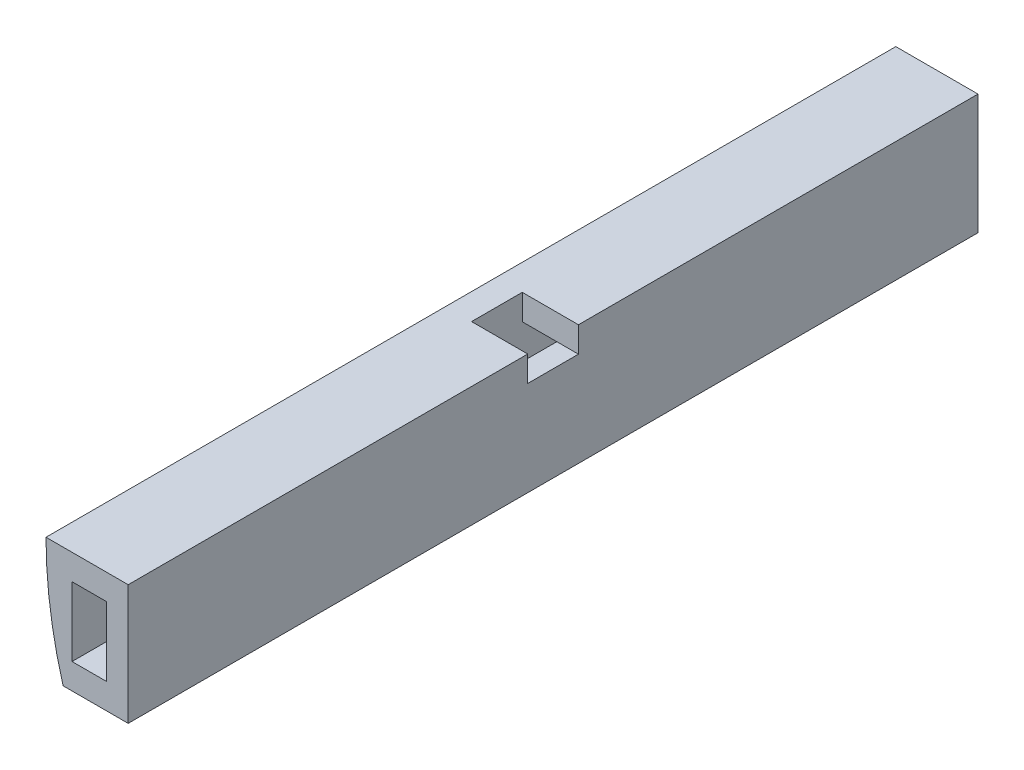
ISO-10303-21;
HEADER;
FILE_DESCRIPTION(('STEP AP214'),'2;1');
FILE_NAME('part.step','',(''),(''),'','','');
FILE_SCHEMA(('AUTOMOTIVE_DESIGN { 1 0 10303 214 1 1 1 1 }'));
ENDSEC;
DATA;
#1=APPLICATION_CONTEXT('core data for automotive mechanical design processes');
#2=APPLICATION_PROTOCOL_DEFINITION('international standard','automotive_design',2000,#1);
#3=PRODUCT_CONTEXT('',#1,'mechanical');
#4=PRODUCT('Part','Part','',(#3));
#5=PRODUCT_RELATED_PRODUCT_CATEGORY('part','',(#4));
#6=PRODUCT_DEFINITION_FORMATION('','',#4);
#7=PRODUCT_DEFINITION_CONTEXT('part definition',#1,'design');
#8=PRODUCT_DEFINITION('design','',#6,#7);
#9=PRODUCT_DEFINITION_SHAPE('','',#8);
#10=(LENGTH_UNIT() NAMED_UNIT(*) SI_UNIT(.MILLI.,.METRE.));
#11=(NAMED_UNIT(*) PLANE_ANGLE_UNIT() SI_UNIT($,.RADIAN.));
#12=(NAMED_UNIT(*) SI_UNIT($,.STERADIAN.) SOLID_ANGLE_UNIT());
#13=UNCERTAINTY_MEASURE_WITH_UNIT(LENGTH_MEASURE(1.E-05),#10,'distance_accuracy_value','');
#14=(GEOMETRIC_REPRESENTATION_CONTEXT(3) GLOBAL_UNCERTAINTY_ASSIGNED_CONTEXT((#13)) GLOBAL_UNIT_ASSIGNED_CONTEXT((#10,
#11,#12)) REPRESENTATION_CONTEXT('',''));
#15=CARTESIAN_POINT('',(0.,0.,0.));
#16=DIRECTION('',(0.,0.,1.));
#17=DIRECTION('',(1.,0.,0.));
#18=AXIS2_PLACEMENT_3D('',#15,#16,#17);
#19=CARTESIAN_POINT('',(0.,-4.4958,149.86));
#20=DIRECTION('',(0.,1.,0.));
#21=DIRECTION('',(0.,0.,1.));
#22=AXIS2_PLACEMENT_3D('',#19,#20,#21);
#23=PLANE('',#22);
#24=DIRECTION('',(-1.,0.,0.));
#25=VECTOR('',#24,1.);
#26=CARTESIAN_POINT('',(-61.5779714003076,-4.4958,70.4596));
#27=LINE('',#26,#25);
#28=CARTESIAN_POINT('',(-61.5779714003076,-4.4958,70.4596));
#29=VERTEX_POINT('',#28);
#30=CARTESIAN_POINT('',(-65.3879714003076,-4.4958,70.4596));
#31=VERTEX_POINT('',#30);
#32=EDGE_CURVE('E137',#29,#31,#27,.T.);
#33=ORIENTED_EDGE('',*,*,#32,.T.);
#34=DIRECTION('',(0.,0.,-1.));
#35=VECTOR('',#34,1.);
#36=CARTESIAN_POINT('',(-65.3879714003076,-4.4958,149.86));
#37=LINE('',#36,#35);
#38=CARTESIAN_POINT('',(-65.3879714003076,-4.4958,79.4004));
#39=VERTEX_POINT('',#38);
#40=EDGE_CURVE('E172',#39,#31,#37,.T.);
#41=ORIENTED_EDGE('',*,*,#40,.F.);
#42=DIRECTION('',(1.,0.,0.));
#43=VECTOR('',#42,1.);
#44=CARTESIAN_POINT('',(-61.5779714003076,-4.4958,79.4004));
#45=LINE('',#44,#43);
#46=CARTESIAN_POINT('',(-61.5779714003076,-4.4958,79.4004));
#47=VERTEX_POINT('',#46);
#48=EDGE_CURVE('E162',#39,#47,#45,.T.);
#49=ORIENTED_EDGE('',*,*,#48,.T.);
#50=DIRECTION('',(0.,0.,-1.));
#51=VECTOR('',#50,1.);
#52=CARTESIAN_POINT('',(-61.5779714003076,-4.4958,149.86));
#53=LINE('',#52,#51);
#54=EDGE_CURVE('E154',#47,#29,#53,.T.);
#55=ORIENTED_EDGE('',*,*,#54,.T.);
#56=EDGE_LOOP('',(#33,#41,#49,#55));
#57=FACE_BOUND('',#56,.T.);
#58=ADVANCED_FACE('F41',(#57),#23,.T.);
#59=CARTESIAN_POINT('',(-71.4839714003076,0.,149.86));
#60=DIRECTION('',(-1.,0.,0.));
#61=DIRECTION('',(0.,0.,1.));
#62=AXIS2_PLACEMENT_3D('',#59,#60,#61);
#63=PLANE('',#62);
#64=DIRECTION('',(0.,1.,0.));
#65=VECTOR('',#64,1.);
#66=CARTESIAN_POINT('',(-71.4839714003076,0.,0.));
#67=LINE('',#66,#65);
#68=CARTESIAN_POINT('',(-71.4839714003076,-16.6878,0.));
#69=VERTEX_POINT('',#68);
#70=CARTESIAN_POINT('',(-71.4839714003076,-4.4958,0.));
#71=VERTEX_POINT('',#70);
#72=EDGE_CURVE('E202',#69,#71,#67,.T.);
#73=ORIENTED_EDGE('',*,*,#72,.T.);
#74=DIRECTION('',(0.,0.,-1.));
#75=VECTOR('',#74,1.);
#76=CARTESIAN_POINT('',(-71.4839714003076,-4.4958,70.4596));
#77=LINE('',#76,#75);
#78=CARTESIAN_POINT('',(-71.4839714003076,-4.4958,70.4596));
#79=VERTEX_POINT('',#78);
#80=EDGE_CURVE('E57',#79,#71,#77,.T.);
#81=ORIENTED_EDGE('',*,*,#80,.F.);
#82=DIRECTION('',(0.,1.,0.));
#83=VECTOR('',#82,1.);
#84=CARTESIAN_POINT('',(-71.4839714003076,-4.4958,70.4596));
#85=LINE('',#84,#83);
#86=CARTESIAN_POINT('',(-71.4839714003076,0.,70.4596));
#87=VERTEX_POINT('',#86);
#88=EDGE_CURVE('E62',#79,#87,#85,.T.);
#89=ORIENTED_EDGE('',*,*,#88,.T.);
#90=DIRECTION('',(0.,0.,-1.));
#91=VECTOR('',#90,1.);
#92=CARTESIAN_POINT('',(-71.4839714003076,0.,149.86));
#93=LINE('',#92,#91);
#94=CARTESIAN_POINT('',(-71.4839714003076,0.,79.4004));
#95=VERTEX_POINT('',#94);
#96=EDGE_CURVE('E11',#95,#87,#93,.T.);
#97=ORIENTED_EDGE('',*,*,#96,.F.);
#98=DIRECTION('',(0.,-1.,0.));
#99=VECTOR('',#98,1.);
#100=CARTESIAN_POINT('',(-71.4839714003076,-4.4958,79.4004));
#101=LINE('',#100,#99);
#102=CARTESIAN_POINT('',(-71.4839714003076,-4.4958,79.4004));
#103=VERTEX_POINT('',#102);
#104=EDGE_CURVE('E251',#95,#103,#101,.T.);
#105=ORIENTED_EDGE('',*,*,#104,.T.);
#106=DIRECTION('',(0.,0.,1.));
#107=VECTOR('',#106,1.);
#108=CARTESIAN_POINT('',(-71.4839714003076,-4.4958,79.4004));
#109=LINE('',#108,#107);
#110=CARTESIAN_POINT('',(-71.4839714003076,-4.4958,149.86));
#111=VERTEX_POINT('',#110);
#112=EDGE_CURVE('E205',#103,#111,#109,.T.);
#113=ORIENTED_EDGE('',*,*,#112,.T.);
#114=DIRECTION('',(0.,1.,0.));
#115=VECTOR('',#114,1.);
#116=CARTESIAN_POINT('',(-71.4839714003076,0.,149.86));
#117=LINE('',#116,#115);
#118=CARTESIAN_POINT('',(-71.4839714003076,-16.6878,149.86));
#119=VERTEX_POINT('',#118);
#120=EDGE_CURVE('E220',#119,#111,#117,.T.);
#121=ORIENTED_EDGE('',*,*,#120,.F.);
#122=DIRECTION('',(0.,0.,-1.));
#123=VECTOR('',#122,1.);
#124=CARTESIAN_POINT('',(-71.4839714003076,-16.6878,149.86));
#125=LINE('',#124,#123);
#126=EDGE_CURVE('E221',#119,#69,#125,.T.);
#127=ORIENTED_EDGE('',*,*,#126,.T.);
#128=EDGE_LOOP('',(#73,#81,#89,#97,#105,#113,#121,#127));
#129=FACE_BOUND('',#128,.T.);
#130=ADVANCED_FACE('F43',(#129),#63,.F.);
#131=CARTESIAN_POINT('',(0.,0.,149.86));
#132=DIRECTION('',(0.,1.,0.));
#133=DIRECTION('',(0.,0.,1.));
#134=AXIS2_PLACEMENT_3D('',#131,#132,#133);
#135=PLANE('',#134);
#136=DIRECTION('',(1.,0.,0.));
#137=VECTOR('',#136,1.);
#138=CARTESIAN_POINT('',(0.,0.,0.));
#139=LINE('',#138,#137);
#140=CARTESIAN_POINT('',(-76.073,0.,0.));
#141=VERTEX_POINT('',#140);
#142=CARTESIAN_POINT('',(-61.5779714003076,0.,0.));
#143=VERTEX_POINT('',#142);
#144=EDGE_CURVE('E195',#141,#143,#139,.T.);
#145=ORIENTED_EDGE('',*,*,#144,.F.);
#146=DIRECTION('',(0.,0.,-1.));
#147=VECTOR('',#146,1.);
#148=CARTESIAN_POINT('',(-76.073,0.,149.86));
#149=LINE('',#148,#147);
#150=CARTESIAN_POINT('',(-76.073,0.,149.86));
#151=VERTEX_POINT('',#150);
#152=EDGE_CURVE('E50',#151,#141,#149,.T.);
#153=ORIENTED_EDGE('',*,*,#152,.F.);
#154=DIRECTION('',(1.,0.,0.));
#155=VECTOR('',#154,1.);
#156=CARTESIAN_POINT('',(0.,0.,149.86));
#157=LINE('',#156,#155);
#158=CARTESIAN_POINT('',(-61.5779714003076,0.,149.86));
#159=VERTEX_POINT('',#158);
#160=EDGE_CURVE('E271',#151,#159,#157,.T.);
#161=ORIENTED_EDGE('',*,*,#160,.T.);
#162=DIRECTION('',(0.,0.,1.));
#163=VECTOR('',#162,1.);
#164=CARTESIAN_POINT('',(-61.5779714003076,0.,79.4004));
#165=LINE('',#164,#163);
#166=CARTESIAN_POINT('',(-61.5779714003076,0.,79.4004));
#167=VERTEX_POINT('',#166);
#168=EDGE_CURVE('E256',#167,#159,#165,.T.);
#169=ORIENTED_EDGE('',*,*,#168,.F.);
#170=DIRECTION('',(-1.,0.,0.));
#171=VECTOR('',#170,1.);
#172=CARTESIAN_POINT('',(-61.5779714003076,0.,79.4004));
#173=LINE('',#172,#171);
#174=EDGE_CURVE('E294',#167,#95,#173,.T.);
#175=ORIENTED_EDGE('',*,*,#174,.T.);
#176=ORIENTED_EDGE('',*,*,#96,.T.);
#177=DIRECTION('',(1.,0.,0.));
#178=VECTOR('',#177,1.);
#179=CARTESIAN_POINT('',(-61.5779714003076,0.,70.4596));
#180=LINE('',#179,#178);
#181=CARTESIAN_POINT('',(-61.5779714003076,0.,70.4596));
#182=VERTEX_POINT('',#181);
#183=EDGE_CURVE('E303',#87,#182,#180,.T.);
#184=ORIENTED_EDGE('',*,*,#183,.T.);
#185=DIRECTION('',(0.,0.,-1.));
#186=VECTOR('',#185,1.);
#187=CARTESIAN_POINT('',(-61.5779714003076,0.,70.4596));
#188=LINE('',#187,#186);
#189=EDGE_CURVE('E157',#182,#143,#188,.T.);
#190=ORIENTED_EDGE('',*,*,#189,.T.);
#191=EDGE_LOOP('',(#145,#153,#161,#169,#175,#176,#184,#190));
#192=FACE_BOUND('',#191,.T.);
#193=ADVANCED_FACE('F200',(#192),#135,.T.);
#194=CARTESIAN_POINT('',(0.,0.,149.86));
#195=DIRECTION('',(0.,0.,-1.));
#196=DIRECTION('',(-1.,0.,0.));
#197=AXIS2_PLACEMENT_3D('',#194,#195,#196);
#198=CYLINDRICAL_SURFACE('',#197,76.073);
#199=CARTESIAN_POINT('',(0.,0.,0.));
#200=DIRECTION('',(0.,0.,1.));
#201=DIRECTION('',(1.,0.,0.));
#202=AXIS2_PLACEMENT_3D('',#199,#200,#201);
#203=CIRCLE('',#202,76.073);
#204=CARTESIAN_POINT('',(-73.0640569640093,-21.1836,0.));
#205=VERTEX_POINT('',#204);
#206=EDGE_CURVE('E184',#141,#205,#203,.T.);
#207=ORIENTED_EDGE('',*,*,#206,.T.);
#208=DIRECTION('',(0.,0.,-1.));
#209=VECTOR('',#208,1.);
#210=CARTESIAN_POINT('',(-73.0640569640093,-21.1836,149.86));
#211=LINE('',#210,#209);
#212=CARTESIAN_POINT('',(-73.0640569640093,-21.1836,149.86));
#213=VERTEX_POINT('',#212);
#214=EDGE_CURVE('E169',#213,#205,#211,.T.);
#215=ORIENTED_EDGE('',*,*,#214,.F.);
#216=CARTESIAN_POINT('',(0.,0.,149.86));
#217=DIRECTION('',(0.,0.,1.));
#218=DIRECTION('',(1.,0.,0.));
#219=AXIS2_PLACEMENT_3D('',#216,#217,#218);
#220=CIRCLE('',#219,76.073);
#221=EDGE_CURVE('E186',#151,#213,#220,.T.);
#222=ORIENTED_EDGE('',*,*,#221,.F.);
#223=ORIENTED_EDGE('',*,*,#152,.T.);
#224=EDGE_LOOP('',(#207,#215,#222,#223));
#225=FACE_BOUND('',#224,.T.);
#226=ADVANCED_FACE('F182',(#225),#198,.T.);
#227=CARTESIAN_POINT('',(0.,-21.1836,149.86));
#228=DIRECTION('',(0.,-1.,0.));
#229=DIRECTION('',(0.,0.,-1.));
#230=AXIS2_PLACEMENT_3D('',#227,#228,#229);
#231=PLANE('',#230);
#232=DIRECTION('',(-1.,0.,0.));
#233=VECTOR('',#232,1.);
#234=CARTESIAN_POINT('',(0.,-21.1836,0.));
#235=LINE('',#234,#233);
#236=CARTESIAN_POINT('',(-61.5779714003076,-21.1836,0.));
#237=VERTEX_POINT('',#236);
#238=EDGE_CURVE('E197',#237,#205,#235,.T.);
#239=ORIENTED_EDGE('',*,*,#238,.F.);
#240=DIRECTION('',(0.,0.,-1.));
#241=VECTOR('',#240,1.);
#242=CARTESIAN_POINT('',(-61.5779714003076,-21.1836,149.86));
#243=LINE('',#242,#241);
#244=CARTESIAN_POINT('',(-61.5779714003076,-21.1836,149.86));
#245=VERTEX_POINT('',#244);
#246=EDGE_CURVE('E164',#245,#237,#243,.T.);
#247=ORIENTED_EDGE('',*,*,#246,.F.);
#248=DIRECTION('',(-1.,0.,0.));
#249=VECTOR('',#248,1.);
#250=CARTESIAN_POINT('',(0.,-21.1836,149.86));
#251=LINE('',#250,#249);
#252=EDGE_CURVE('E276',#245,#213,#251,.T.);
#253=ORIENTED_EDGE('',*,*,#252,.T.);
#254=ORIENTED_EDGE('',*,*,#214,.T.);
#255=EDGE_LOOP('',(#239,#247,#253,#254));
#256=FACE_BOUND('',#255,.T.);
#257=ADVANCED_FACE('F334',(#256),#231,.T.);
#258=CARTESIAN_POINT('',(-61.5779714003076,0.,149.86));
#259=DIRECTION('',(1.,0.,0.));
#260=DIRECTION('',(0.,0.,-1.));
#261=AXIS2_PLACEMENT_3D('',#258,#259,#260);
#262=PLANE('',#261);
#263=DIRECTION('',(0.,-1.,0.));
#264=VECTOR('',#263,1.);
#265=CARTESIAN_POINT('',(-61.5779714003076,0.,0.));
#266=LINE('',#265,#264);
#267=EDGE_CURVE('E211',#143,#237,#266,.T.);
#268=ORIENTED_EDGE('',*,*,#267,.F.);
#269=ORIENTED_EDGE('',*,*,#189,.F.);
#270=DIRECTION('',(0.,-1.,0.));
#271=VECTOR('',#270,1.);
#272=CARTESIAN_POINT('',(-61.5779714003076,-4.4958,70.4596));
#273=LINE('',#272,#271);
#274=EDGE_CURVE('E141',#182,#29,#273,.T.);
#275=ORIENTED_EDGE('',*,*,#274,.T.);
#276=ORIENTED_EDGE('',*,*,#54,.F.);
#277=DIRECTION('',(0.,1.,0.));
#278=VECTOR('',#277,1.);
#279=CARTESIAN_POINT('',(-61.5779714003076,-4.4958,79.4004));
#280=LINE('',#279,#278);
#281=EDGE_CURVE('E249',#47,#167,#280,.T.);
#282=ORIENTED_EDGE('',*,*,#281,.T.);
#283=ORIENTED_EDGE('',*,*,#168,.T.);
#284=DIRECTION('',(0.,-1.,0.));
#285=VECTOR('',#284,1.);
#286=CARTESIAN_POINT('',(-61.5779714003076,0.,149.86));
#287=LINE('',#286,#285);
#288=EDGE_CURVE('E280',#159,#245,#287,.T.);
#289=ORIENTED_EDGE('',*,*,#288,.T.);
#290=ORIENTED_EDGE('',*,*,#246,.T.);
#291=EDGE_LOOP('',(#268,#269,#275,#276,#282,#283,#289,#290));
#292=FACE_BOUND('',#291,.T.);
#293=ADVANCED_FACE('F152',(#292),#262,.T.);
#294=CARTESIAN_POINT('',(-65.3879714003076,0.,149.86));
#295=DIRECTION('',(1.,0.,0.));
#296=DIRECTION('',(0.,0.,-1.));
#297=AXIS2_PLACEMENT_3D('',#294,#295,#296);
#298=PLANE('',#297);
#299=DIRECTION('',(0.,-1.,0.));
#300=VECTOR('',#299,1.);
#301=CARTESIAN_POINT('',(-65.3879714003076,0.,0.));
#302=LINE('',#301,#300);
#303=CARTESIAN_POINT('',(-65.3879714003076,-4.4958,0.));
#304=VERTEX_POINT('',#303);
#305=CARTESIAN_POINT('',(-65.3879714003076,-16.6878,0.));
#306=VERTEX_POINT('',#305);
#307=EDGE_CURVE('E214',#304,#306,#302,.T.);
#308=ORIENTED_EDGE('',*,*,#307,.T.);
#309=DIRECTION('',(0.,0.,-1.));
#310=VECTOR('',#309,1.);
#311=CARTESIAN_POINT('',(-65.3879714003076,-16.6878,149.86));
#312=LINE('',#311,#310);
#313=CARTESIAN_POINT('',(-65.3879714003076,-16.6878,149.86));
#314=VERTEX_POINT('',#313);
#315=EDGE_CURVE('E224',#314,#306,#312,.T.);
#316=ORIENTED_EDGE('',*,*,#315,.F.);
#317=DIRECTION('',(0.,-1.,0.));
#318=VECTOR('',#317,1.);
#319=CARTESIAN_POINT('',(-65.3879714003076,0.,149.86));
#320=LINE('',#319,#318);
#321=CARTESIAN_POINT('',(-65.3879714003076,-4.4958,149.86));
#322=VERTEX_POINT('',#321);
#323=EDGE_CURVE('E239',#322,#314,#320,.T.);
#324=ORIENTED_EDGE('',*,*,#323,.F.);
#325=EDGE_CURVE('E165',#322,#39,#37,.T.);
#326=ORIENTED_EDGE('',*,*,#325,.T.);
#327=ORIENTED_EDGE('',*,*,#40,.T.);
#328=DIRECTION('',(0.,0.,-1.));
#329=VECTOR('',#328,1.);
#330=CARTESIAN_POINT('',(-65.3879714003076,-4.4958,149.86));
#331=LINE('',#330,#329);
#332=EDGE_CURVE('E236',#31,#304,#331,.T.);
#333=ORIENTED_EDGE('',*,*,#332,.T.);
#334=EDGE_LOOP('',(#308,#316,#324,#326,#327,#333));
#335=FACE_BOUND('',#334,.T.);
#336=ADVANCED_FACE('F235',(#335),#298,.F.);
#337=CARTESIAN_POINT('',(0.,-16.6878,149.86));
#338=DIRECTION('',(0.,-1.,0.));
#339=DIRECTION('',(0.,0.,-1.));
#340=AXIS2_PLACEMENT_3D('',#337,#338,#339);
#341=PLANE('',#340);
#342=DIRECTION('',(-1.,0.,0.));
#343=VECTOR('',#342,1.);
#344=CARTESIAN_POINT('',(0.,-16.6878,0.));
#345=LINE('',#344,#343);
#346=EDGE_CURVE('E217',#306,#69,#345,.T.);
#347=ORIENTED_EDGE('',*,*,#346,.T.);
#348=ORIENTED_EDGE('',*,*,#126,.F.);
#349=DIRECTION('',(-1.,0.,0.));
#350=VECTOR('',#349,1.);
#351=CARTESIAN_POINT('',(0.,-16.6878,149.86));
#352=LINE('',#351,#350);
#353=EDGE_CURVE('E225',#314,#119,#352,.T.);
#354=ORIENTED_EDGE('',*,*,#353,.F.);
#355=ORIENTED_EDGE('',*,*,#315,.T.);
#356=EDGE_LOOP('',(#347,#348,#354,#355));
#357=FACE_BOUND('',#356,.T.);
#358=ADVANCED_FACE('F290',(#357),#341,.F.);
#359=CARTESIAN_POINT('',(0.,0.,149.86));
#360=DIRECTION('',(0.,0.,1.));
#361=DIRECTION('',(1.,0.,0.));
#362=AXIS2_PLACEMENT_3D('',#359,#360,#361);
#363=PLANE('',#362);
#364=ORIENTED_EDGE('',*,*,#288,.F.);
#365=ORIENTED_EDGE('',*,*,#160,.F.);
#366=ORIENTED_EDGE('',*,*,#221,.T.);
#367=ORIENTED_EDGE('',*,*,#252,.F.);
#368=EDGE_LOOP('',(#364,#365,#366,#367));
#369=FACE_BOUND('',#368,.T.);
#370=ORIENTED_EDGE('',*,*,#120,.T.);
#371=DIRECTION('',(1.,0.,0.));
#372=VECTOR('',#371,1.);
#373=CARTESIAN_POINT('',(-61.5779714003076,-4.4958,149.86));
#374=LINE('',#373,#372);
#375=EDGE_CURVE('E263',#111,#322,#374,.T.);
#376=ORIENTED_EDGE('',*,*,#375,.T.);
#377=ORIENTED_EDGE('',*,*,#323,.T.);
#378=ORIENTED_EDGE('',*,*,#353,.T.);
#379=EDGE_LOOP('',(#370,#376,#377,#378));
#380=FACE_BOUND('',#379,.T.);
#381=ADVANCED_FACE('F288',(#369,#380),#363,.T.);
#382=CARTESIAN_POINT('',(0.,0.,0.));
#383=DIRECTION('',(0.,0.,1.));
#384=DIRECTION('',(1.,0.,0.));
#385=AXIS2_PLACEMENT_3D('',#382,#383,#384);
#386=PLANE('',#385);
#387=ORIENTED_EDGE('',*,*,#144,.T.);
#388=ORIENTED_EDGE('',*,*,#267,.T.);
#389=ORIENTED_EDGE('',*,*,#238,.T.);
#390=ORIENTED_EDGE('',*,*,#206,.F.);
#391=EDGE_LOOP('',(#387,#388,#389,#390));
#392=FACE_BOUND('',#391,.T.);
#393=ORIENTED_EDGE('',*,*,#72,.F.);
#394=ORIENTED_EDGE('',*,*,#346,.F.);
#395=ORIENTED_EDGE('',*,*,#307,.F.);
#396=DIRECTION('',(-1.,0.,0.));
#397=VECTOR('',#396,1.);
#398=CARTESIAN_POINT('',(-61.5779714003076,-4.4958,0.));
#399=LINE('',#398,#397);
#400=EDGE_CURVE('E159',#304,#71,#399,.T.);
#401=ORIENTED_EDGE('',*,*,#400,.T.);
#402=EDGE_LOOP('',(#393,#394,#395,#401));
#403=FACE_BOUND('',#402,.T.);
#404=ADVANCED_FACE('F192',(#392,#403),#386,.F.);
#405=CARTESIAN_POINT('',(-61.5779714003076,-4.4958,79.4004));
#406=DIRECTION('',(0.,-1.,0.));
#407=DIRECTION('',(0.,0.,-1.));
#408=AXIS2_PLACEMENT_3D('',#405,#406,#407);
#409=PLANE('',#408);
#410=ORIENTED_EDGE('',*,*,#325,.F.);
#411=ORIENTED_EDGE('',*,*,#375,.F.);
#412=ORIENTED_EDGE('',*,*,#112,.F.);
#413=EDGE_CURVE('E246',#103,#39,#45,.T.);
#414=ORIENTED_EDGE('',*,*,#413,.T.);
#415=EDGE_LOOP('',(#410,#411,#412,#414));
#416=FACE_BOUND('',#415,.T.);
#417=ADVANCED_FACE('F253',(#416),#409,.T.);
#418=CARTESIAN_POINT('',(0.,0.,79.4004));
#419=DIRECTION('',(0.,0.,1.));
#420=DIRECTION('',(1.,0.,0.));
#421=AXIS2_PLACEMENT_3D('',#418,#419,#420);
#422=PLANE('',#421);
#423=ORIENTED_EDGE('',*,*,#281,.F.);
#424=ORIENTED_EDGE('',*,*,#48,.F.);
#425=ORIENTED_EDGE('',*,*,#413,.F.);
#426=ORIENTED_EDGE('',*,*,#104,.F.);
#427=ORIENTED_EDGE('',*,*,#174,.F.);
#428=EDGE_LOOP('',(#423,#424,#425,#426,#427));
#429=FACE_BOUND('',#428,.T.);
#430=ADVANCED_FACE('F245',(#429),#422,.F.);
#431=CARTESIAN_POINT('',(-61.5779714003076,-4.4958,70.4596));
#432=DIRECTION('',(0.,-1.,0.));
#433=DIRECTION('',(0.,0.,-1.));
#434=AXIS2_PLACEMENT_3D('',#431,#432,#433);
#435=PLANE('',#434);
#436=ORIENTED_EDGE('',*,*,#332,.F.);
#437=EDGE_CURVE('E143',#31,#79,#27,.T.);
#438=ORIENTED_EDGE('',*,*,#437,.T.);
#439=ORIENTED_EDGE('',*,*,#80,.T.);
#440=ORIENTED_EDGE('',*,*,#400,.F.);
#441=EDGE_LOOP('',(#436,#438,#439,#440));
#442=FACE_BOUND('',#441,.T.);
#443=ADVANCED_FACE('F314',(#442),#435,.T.);
#444=CARTESIAN_POINT('',(0.,0.,70.4596));
#445=DIRECTION('',(0.,0.,1.));
#446=DIRECTION('',(1.,0.,0.));
#447=AXIS2_PLACEMENT_3D('',#444,#445,#446);
#448=PLANE('',#447);
#449=ORIENTED_EDGE('',*,*,#274,.F.);
#450=ORIENTED_EDGE('',*,*,#183,.F.);
#451=ORIENTED_EDGE('',*,*,#88,.F.);
#452=ORIENTED_EDGE('',*,*,#437,.F.);
#453=ORIENTED_EDGE('',*,*,#32,.F.);
#454=EDGE_LOOP('',(#449,#450,#451,#452,#453));
#455=FACE_BOUND('',#454,.T.);
#456=ADVANCED_FACE('F139',(#455),#448,.T.);
#457=CLOSED_SHELL('',(#58,#130,#193,#226,#257,#293,#336,#358,#381,#404,#417,#430,#443,#456));
#458=MANIFOLD_SOLID_BREP('B2',#457);
#459=ADVANCED_BREP_SHAPE_REPRESENTATION('',(#18,#458),#14);
#460=SHAPE_DEFINITION_REPRESENTATION(#9,#459);
ENDSEC;
END-ISO-10303-21;
